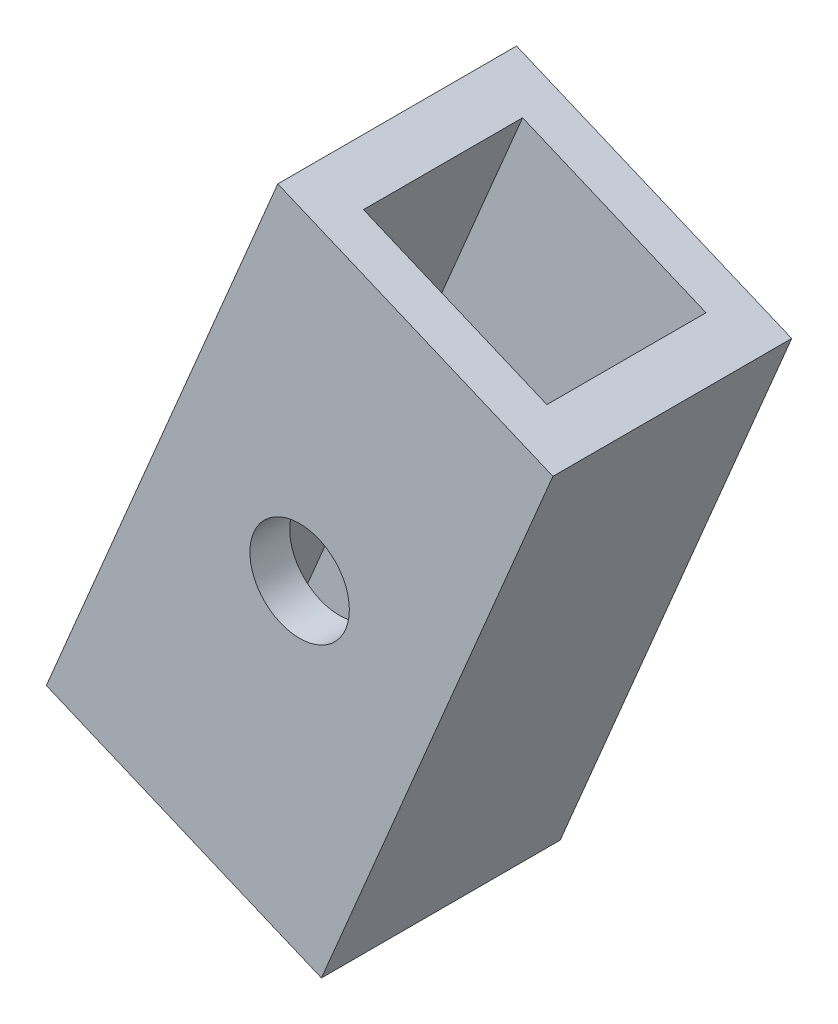
ISO-10303-21;
HEADER;
FILE_DESCRIPTION(('STEP AP214'),'2;1');
FILE_NAME('part.step','',(''),(''),'','','');
FILE_SCHEMA(('AUTOMOTIVE_DESIGN { 1 0 10303 214 1 1 1 1 }'));
ENDSEC;
DATA;
#1=APPLICATION_CONTEXT('core data for automotive mechanical design processes');
#2=APPLICATION_PROTOCOL_DEFINITION('international standard','automotive_design',2000,#1);
#3=PRODUCT_CONTEXT('',#1,'mechanical');
#4=PRODUCT('Part','Part','',(#3));
#5=PRODUCT_RELATED_PRODUCT_CATEGORY('part','',(#4));
#6=PRODUCT_DEFINITION_FORMATION('','',#4);
#7=PRODUCT_DEFINITION_CONTEXT('part definition',#1,'design');
#8=PRODUCT_DEFINITION('design','',#6,#7);
#9=PRODUCT_DEFINITION_SHAPE('','',#8);
#10=(LENGTH_UNIT() NAMED_UNIT(*) SI_UNIT(.MILLI.,.METRE.));
#11=(NAMED_UNIT(*) PLANE_ANGLE_UNIT() SI_UNIT($,.RADIAN.));
#12=(NAMED_UNIT(*) SI_UNIT($,.STERADIAN.) SOLID_ANGLE_UNIT());
#13=UNCERTAINTY_MEASURE_WITH_UNIT(LENGTH_MEASURE(1.E-05),#10,'distance_accuracy_value','');
#14=(GEOMETRIC_REPRESENTATION_CONTEXT(3) GLOBAL_UNCERTAINTY_ASSIGNED_CONTEXT((#13)) GLOBAL_UNIT_ASSIGNED_CONTEXT((#10,
#11,#12)) REPRESENTATION_CONTEXT('',''));
#15=CARTESIAN_POINT('',(0.,0.,0.));
#16=DIRECTION('',(0.,0.,1.));
#17=DIRECTION('',(1.,0.,0.));
#18=AXIS2_PLACEMENT_3D('',#15,#16,#17);
#19=CARTESIAN_POINT('',(59.7500148014689,161.344102205265,20.));
#20=DIRECTION('',(0.921732380952381,-0.387826530685892,0.));
#21=DIRECTION('',(0.387826530685892,0.921732380952381,0.));
#22=AXIS2_PLACEMENT_3D('',#19,#20,#21);
#23=PLANE('',#22);
#24=DIRECTION('',(-0.387826530685892,-0.921732380952381,0.));
#25=VECTOR('',#24,1.);
#26=CARTESIAN_POINT('',(59.7500148014689,161.344102205265,8.));
#27=LINE('',#26,#25);
#28=CARTESIAN_POINT('',(59.7500148014689,161.344102205265,8.));
#29=VERTEX_POINT('',#28);
#30=CARTESIAN_POINT('',(48.1152188808921,133.692130776694,8.));
#31=VERTEX_POINT('',#30);
#32=EDGE_CURVE('E135',#29,#31,#27,.T.);
#33=ORIENTED_EDGE('',*,*,#32,.T.);
#34=DIRECTION('',(0.,0.,-1.));
#35=VECTOR('',#34,1.);
#36=CARTESIAN_POINT('',(48.1152188808921,133.692130776694,20.));
#37=LINE('',#36,#35);
#38=CARTESIAN_POINT('',(48.1152188808921,133.692130776694,20.));
#39=VERTEX_POINT('',#38);
#40=EDGE_CURVE('E11',#39,#31,#37,.T.);
#41=ORIENTED_EDGE('',*,*,#40,.F.);
#42=DIRECTION('',(-0.387826530685892,-0.921732380952381,0.));
#43=VECTOR('',#42,1.);
#44=CARTESIAN_POINT('',(59.7500148014689,161.344102205265,20.));
#45=LINE('',#44,#43);
#46=CARTESIAN_POINT('',(59.7500148014689,161.344102205265,20.));
#47=VERTEX_POINT('',#46);
#48=EDGE_CURVE('E136',#47,#39,#45,.T.);
#49=ORIENTED_EDGE('',*,*,#48,.F.);
#50=DIRECTION('',(0.,0.,-1.));
#51=VECTOR('',#50,1.);
#52=CARTESIAN_POINT('',(59.7500148014689,161.344102205265,20.));
#53=LINE('',#52,#51);
#54=EDGE_CURVE('E146',#47,#29,#53,.T.);
#55=ORIENTED_EDGE('',*,*,#54,.T.);
#56=EDGE_LOOP('',(#33,#41,#49,#55));
#57=FACE_BOUND('',#56,.T.);
#58=ADVANCED_FACE('F34',(#57),#23,.F.);
#59=CARTESIAN_POINT('',(48.1152188808921,133.692130776694,20.));
#60=DIRECTION('',(0.387826530685892,0.921732380952381,0.));
#61=DIRECTION('',(-0.921732380952381,0.387826530685892,0.));
#62=AXIS2_PLACEMENT_3D('',#59,#60,#61);
#63=PLANE('',#62);
#64=DIRECTION('',(0.,0.,-1.));
#65=VECTOR('',#64,1.);
#66=CARTESIAN_POINT('',(50.4195498332731,132.722564449979,20.));
#67=LINE('',#66,#65);
#68=CARTESIAN_POINT('',(50.4195498332731,132.722564449979,18.));
#69=VERTEX_POINT('',#68);
#70=CARTESIAN_POINT('',(50.4195498332731,132.722564449979,10.0020474927602));
#71=VERTEX_POINT('',#70);
#72=EDGE_CURVE('E130',#69,#71,#67,.T.);
#73=ORIENTED_EDGE('',*,*,#72,.F.);
#74=DIRECTION('',(0.921732380952381,-0.387826530685892,0.));
#75=VECTOR('',#74,1.);
#76=CARTESIAN_POINT('',(48.1152188808921,133.692130776694,18.));
#77=LINE('',#76,#75);
#78=CARTESIAN_POINT('',(59.6368736427969,128.84429914312,18.));
#79=VERTEX_POINT('',#78);
#80=EDGE_CURVE('E132',#69,#79,#77,.T.);
#81=ORIENTED_EDGE('',*,*,#80,.T.);
#82=DIRECTION('',(0.,0.,-1.));
#83=VECTOR('',#82,1.);
#84=CARTESIAN_POINT('',(59.6368736427969,128.84429914312,20.));
#85=LINE('',#84,#83);
#86=CARTESIAN_POINT('',(59.6368736427969,128.84429914312,10.0020474927602));
#87=VERTEX_POINT('',#86);
#88=EDGE_CURVE('E125',#79,#87,#85,.T.);
#89=ORIENTED_EDGE('',*,*,#88,.T.);
#90=DIRECTION('',(0.921732380952381,-0.387826530685892,0.));
#91=VECTOR('',#90,1.);
#92=CARTESIAN_POINT('',(48.1152188808921,133.692130776694,10.0020474927602));
#93=LINE('',#92,#91);
#94=EDGE_CURVE('E105',#71,#87,#93,.T.);
#95=ORIENTED_EDGE('',*,*,#94,.F.);
#96=EDGE_LOOP('',(#73,#81,#89,#95));
#97=FACE_BOUND('',#96,.T.);
#98=DIRECTION('',(0.921732380952381,-0.387826530685892,0.));
#99=VECTOR('',#98,1.);
#100=CARTESIAN_POINT('',(48.1152188808921,133.692130776694,8.));
#101=LINE('',#100,#99);
#102=CARTESIAN_POINT('',(61.9412045951779,127.874732816405,8.));
#103=VERTEX_POINT('',#102);
#104=EDGE_CURVE('E149',#31,#103,#101,.T.);
#105=ORIENTED_EDGE('',*,*,#104,.T.);
#106=DIRECTION('',(0.,0.,-1.));
#107=VECTOR('',#106,1.);
#108=CARTESIAN_POINT('',(61.9412045951779,127.874732816405,20.));
#109=LINE('',#108,#107);
#110=CARTESIAN_POINT('',(61.9412045951779,127.874732816405,20.));
#111=VERTEX_POINT('',#110);
#112=EDGE_CURVE('E42',#111,#103,#109,.T.);
#113=ORIENTED_EDGE('',*,*,#112,.F.);
#114=DIRECTION('',(0.921732380952381,-0.387826530685892,0.));
#115=VECTOR('',#114,1.);
#116=CARTESIAN_POINT('',(48.1152188808921,133.692130776694,20.));
#117=LINE('',#116,#115);
#118=EDGE_CURVE('E139',#39,#111,#117,.T.);
#119=ORIENTED_EDGE('',*,*,#118,.F.);
#120=ORIENTED_EDGE('',*,*,#40,.T.);
#121=EDGE_LOOP('',(#105,#113,#119,#120));
#122=FACE_BOUND('',#121,.T.);
#123=ADVANCED_FACE('F178',(#97,#122),#63,.F.);
#124=CARTESIAN_POINT('',(73.5760005157546,155.526704244977,20.));
#125=DIRECTION('',(-0.921732380952381,0.387826530685892,0.));
#126=DIRECTION('',(-0.387826530685892,-0.921732380952381,0.));
#127=AXIS2_PLACEMENT_3D('',#124,#125,#126);
#128=PLANE('',#127);
#129=DIRECTION('',(0.387826530685891,0.921732380952381,0.));
#130=VECTOR('',#129,1.);
#131=CARTESIAN_POINT('',(73.5760005157546,155.526704244977,8.));
#132=LINE('',#131,#130);
#133=CARTESIAN_POINT('',(73.5760005157546,155.526704244977,8.));
#134=VERTEX_POINT('',#133);
#135=EDGE_CURVE('E151',#103,#134,#132,.T.);
#136=ORIENTED_EDGE('',*,*,#135,.T.);
#137=DIRECTION('',(0.,0.,-1.));
#138=VECTOR('',#137,1.);
#139=CARTESIAN_POINT('',(73.5760005157546,155.526704244977,20.));
#140=LINE('',#139,#138);
#141=CARTESIAN_POINT('',(73.5760005157546,155.526704244977,20.));
#142=VERTEX_POINT('',#141);
#143=EDGE_CURVE('E156',#142,#134,#140,.T.);
#144=ORIENTED_EDGE('',*,*,#143,.F.);
#145=DIRECTION('',(0.387826530685891,0.921732380952381,0.));
#146=VECTOR('',#145,1.);
#147=CARTESIAN_POINT('',(73.5760005157546,155.526704244977,20.));
#148=LINE('',#147,#146);
#149=EDGE_CURVE('E142',#111,#142,#148,.T.);
#150=ORIENTED_EDGE('',*,*,#149,.F.);
#151=ORIENTED_EDGE('',*,*,#112,.T.);
#152=EDGE_LOOP('',(#136,#144,#150,#151));
#153=FACE_BOUND('',#152,.T.);
#154=ADVANCED_FACE('F164',(#153),#128,.F.);
#155=CARTESIAN_POINT('',(59.7500148014689,161.344102205265,20.));
#156=DIRECTION('',(-0.387826530685892,-0.921732380952381,0.));
#157=DIRECTION('',(0.921732380952381,-0.387826530685892,0.));
#158=AXIS2_PLACEMENT_3D('',#155,#156,#157);
#159=PLANE('',#158);
#160=DIRECTION('',(0.,0.,-1.));
#161=VECTOR('',#160,1.);
#162=CARTESIAN_POINT('',(71.2716695633737,156.496270571691,1.00613961606655E-13));
#163=LINE('',#162,#161);
#164=CARTESIAN_POINT('',(71.2716695633736,156.496270571691,18.));
#165=VERTEX_POINT('',#164);
#166=CARTESIAN_POINT('',(71.2716695633737,156.496270571691,10.0020474927602));
#167=VERTEX_POINT('',#166);
#168=EDGE_CURVE('E111',#165,#167,#163,.T.);
#169=ORIENTED_EDGE('',*,*,#168,.F.);
#170=DIRECTION('',(0.921732380952381,-0.387826530685893,0.));
#171=VECTOR('',#170,1.);
#172=CARTESIAN_POINT('',(66.6630076586119,158.435403225121,18.));
#173=LINE('',#172,#171);
#174=CARTESIAN_POINT('',(62.0543457538499,160.37453587855,18.));
#175=VERTEX_POINT('',#174);
#176=EDGE_CURVE('E57',#175,#165,#173,.T.);
#177=ORIENTED_EDGE('',*,*,#176,.F.);
#178=DIRECTION('',(0.,0.,-1.));
#179=VECTOR('',#178,1.);
#180=CARTESIAN_POINT('',(62.0543457538499,160.37453587855,1.00613961606655E-13));
#181=LINE('',#180,#179);
#182=CARTESIAN_POINT('',(62.0543457538499,160.37453587855,10.0020474927602));
#183=VERTEX_POINT('',#182);
#184=EDGE_CURVE('E118',#175,#183,#181,.T.);
#185=ORIENTED_EDGE('',*,*,#184,.T.);
#186=DIRECTION('',(0.921732380952381,-0.387826530685893,0.));
#187=VECTOR('',#186,1.);
#188=CARTESIAN_POINT('',(66.6630076586119,158.435403225121,10.0020474927602));
#189=LINE('',#188,#187);
#190=EDGE_CURVE('E102',#183,#167,#189,.T.);
#191=ORIENTED_EDGE('',*,*,#190,.T.);
#192=EDGE_LOOP('',(#169,#177,#185,#191));
#193=FACE_BOUND('',#192,.T.);
#194=DIRECTION('',(-0.921732380952381,0.387826530685892,0.));
#195=VECTOR('',#194,1.);
#196=CARTESIAN_POINT('',(59.7500148014689,161.344102205265,8.));
#197=LINE('',#196,#195);
#198=EDGE_CURVE('E140',#134,#29,#197,.T.);
#199=ORIENTED_EDGE('',*,*,#198,.T.);
#200=ORIENTED_EDGE('',*,*,#54,.F.);
#201=DIRECTION('',(-0.921732380952381,0.387826530685892,0.));
#202=VECTOR('',#201,1.);
#203=CARTESIAN_POINT('',(59.7500148014689,161.344102205265,20.));
#204=LINE('',#203,#202);
#205=EDGE_CURVE('E144',#142,#47,#204,.T.);
#206=ORIENTED_EDGE('',*,*,#205,.F.);
#207=ORIENTED_EDGE('',*,*,#143,.T.);
#208=EDGE_LOOP('',(#199,#200,#206,#207));
#209=FACE_BOUND('',#208,.T.);
#210=ADVANCED_FACE('F115',(#193,#209),#159,.F.);
#211=CARTESIAN_POINT('',(0.,0.,20.));
#212=DIRECTION('',(0.,0.,1.));
#213=DIRECTION('',(1.,0.,0.));
#214=AXIS2_PLACEMENT_3D('',#211,#212,#213);
#215=PLANE('',#214);
#216=CARTESIAN_POINT('',(60.8456096983234,144.609417510835,20.));
#217=DIRECTION('',(0.,0.,1.));
#218=DIRECTION('',(1.,0.,0.));
#219=AXIS2_PLACEMENT_3D('',#216,#217,#218);
#220=CIRCLE('',#219,2.5);
#221=CARTESIAN_POINT('',(63.3456096983234,144.609417510835,20.));
#222=VERTEX_POINT('',#221);
#223=EDGE_CURVE('E228',#222,#222,#220,.T.);
#224=ORIENTED_EDGE('',*,*,#223,.F.);
#225=EDGE_LOOP('',(#224));
#226=FACE_BOUND('',#225,.T.);
#227=ORIENTED_EDGE('',*,*,#48,.T.);
#228=ORIENTED_EDGE('',*,*,#118,.T.);
#229=ORIENTED_EDGE('',*,*,#149,.T.);
#230=ORIENTED_EDGE('',*,*,#205,.T.);
#231=EDGE_LOOP('',(#227,#228,#229,#230));
#232=FACE_BOUND('',#231,.T.);
#233=ADVANCED_FACE('F177',(#226,#232),#215,.T.);
#234=CARTESIAN_POINT('',(0.,0.,8.));
#235=DIRECTION('',(0.,0.,1.));
#236=DIRECTION('',(1.,0.,0.));
#237=AXIS2_PLACEMENT_3D('',#234,#235,#236);
#238=PLANE('',#237);
#239=CARTESIAN_POINT('',(60.8456096983234,144.609417510835,8.));
#240=DIRECTION('',(0.,0.,1.));
#241=DIRECTION('',(1.,0.,0.));
#242=AXIS2_PLACEMENT_3D('',#239,#240,#241);
#243=CIRCLE('',#242,2.5);
#244=CARTESIAN_POINT('',(63.3456096983234,144.609417510835,8.));
#245=VERTEX_POINT('',#244);
#246=EDGE_CURVE('E222',#245,#245,#243,.T.);
#247=ORIENTED_EDGE('',*,*,#246,.T.);
#248=EDGE_LOOP('',(#247));
#249=FACE_BOUND('',#248,.T.);
#250=ORIENTED_EDGE('',*,*,#32,.F.);
#251=ORIENTED_EDGE('',*,*,#198,.F.);
#252=ORIENTED_EDGE('',*,*,#135,.F.);
#253=ORIENTED_EDGE('',*,*,#104,.F.);
#254=EDGE_LOOP('',(#250,#251,#252,#253));
#255=FACE_BOUND('',#254,.T.);
#256=ADVANCED_FACE('F170',(#249,#255),#238,.F.);
#257=CARTESIAN_POINT('',(53.0890790846057,126.174769891788,18.));
#258=DIRECTION('',(0.,0.,1.));
#259=DIRECTION('',(1.,0.,0.));
#260=AXIS2_PLACEMENT_3D('',#257,#258,#259);
#261=PLANE('',#260);
#262=CARTESIAN_POINT('',(60.8456096983234,144.609417510835,18.));
#263=DIRECTION('',(0.,0.,1.));
#264=DIRECTION('',(1.,0.,0.));
#265=AXIS2_PLACEMENT_3D('',#262,#263,#264);
#266=CIRCLE('',#265,2.5);
#267=CARTESIAN_POINT('',(63.3456096983234,144.609417510835,18.));
#268=VERTEX_POINT('',#267);
#269=EDGE_CURVE('E223',#268,#268,#266,.T.);
#270=ORIENTED_EDGE('',*,*,#269,.T.);
#271=EDGE_LOOP('',(#270));
#272=FACE_BOUND('',#271,.T.);
#273=DIRECTION('',(0.387826530685892,0.921732380952381,0.));
#274=VECTOR('',#273,1.);
#275=CARTESIAN_POINT('',(48.4804171798436,128.113902545217,18.));
#276=LINE('',#275,#274);
#277=EDGE_CURVE('E123',#69,#175,#276,.T.);
#278=ORIENTED_EDGE('',*,*,#277,.T.);
#279=ORIENTED_EDGE('',*,*,#176,.T.);
#280=DIRECTION('',(0.387826530685892,0.921732380952381,0.));
#281=VECTOR('',#280,1.);
#282=CARTESIAN_POINT('',(57.6977409893674,124.235637238358,18.));
#283=LINE('',#282,#281);
#284=EDGE_CURVE('E108',#79,#165,#283,.T.);
#285=ORIENTED_EDGE('',*,*,#284,.F.);
#286=ORIENTED_EDGE('',*,*,#80,.F.);
#287=EDGE_LOOP('',(#278,#279,#285,#286));
#288=FACE_BOUND('',#287,.T.);
#289=ADVANCED_FACE('F192',(#272,#288),#261,.F.);
#290=CARTESIAN_POINT('',(48.4804171798436,128.113902545217,1.00613961606655E-13));
#291=DIRECTION('',(0.921732380952381,-0.387826530685892,0.));
#292=DIRECTION('',(0.387826530685892,0.921732380952381,0.));
#293=AXIS2_PLACEMENT_3D('',#290,#291,#292);
#294=PLANE('',#293);
#295=ORIENTED_EDGE('',*,*,#72,.T.);
#296=DIRECTION('',(0.387826530685892,0.921732380952381,0.));
#297=VECTOR('',#296,1.);
#298=CARTESIAN_POINT('',(48.4804171798436,128.113902545217,10.0020474927602));
#299=LINE('',#298,#297);
#300=EDGE_CURVE('E107',#71,#183,#299,.T.);
#301=ORIENTED_EDGE('',*,*,#300,.T.);
#302=ORIENTED_EDGE('',*,*,#184,.F.);
#303=ORIENTED_EDGE('',*,*,#277,.F.);
#304=EDGE_LOOP('',(#295,#301,#302,#303));
#305=FACE_BOUND('',#304,.T.);
#306=ADVANCED_FACE('F199',(#305),#294,.T.);
#307=CARTESIAN_POINT('',(53.0890790846057,126.174769891788,10.0020474927602));
#308=DIRECTION('',(0.,0.,1.));
#309=DIRECTION('',(1.,0.,0.));
#310=AXIS2_PLACEMENT_3D('',#307,#308,#309);
#311=PLANE('',#310);
#312=CARTESIAN_POINT('',(60.8456096983234,144.609417510835,10.0020474927602));
#313=DIRECTION('',(0.,0.,1.));
#314=DIRECTION('',(1.,0.,0.));
#315=AXIS2_PLACEMENT_3D('',#312,#313,#314);
#316=CIRCLE('',#315,2.5);
#317=CARTESIAN_POINT('',(63.3456096983234,144.609417510835,10.0020474927602));
#318=VERTEX_POINT('',#317);
#319=EDGE_CURVE('E37',#318,#318,#316,.T.);
#320=ORIENTED_EDGE('',*,*,#319,.F.);
#321=EDGE_LOOP('',(#320));
#322=FACE_BOUND('',#321,.T.);
#323=ORIENTED_EDGE('',*,*,#94,.T.);
#324=DIRECTION('',(0.387826530685892,0.921732380952381,0.));
#325=VECTOR('',#324,1.);
#326=CARTESIAN_POINT('',(57.6977409893674,124.235637238358,10.0020474927602));
#327=LINE('',#326,#325);
#328=EDGE_CURVE('E49',#87,#167,#327,.T.);
#329=ORIENTED_EDGE('',*,*,#328,.T.);
#330=ORIENTED_EDGE('',*,*,#190,.F.);
#331=ORIENTED_EDGE('',*,*,#300,.F.);
#332=EDGE_LOOP('',(#323,#329,#330,#331));
#333=FACE_BOUND('',#332,.T.);
#334=ADVANCED_FACE('F99',(#322,#333),#311,.T.);
#335=CARTESIAN_POINT('',(57.6977409893674,124.235637238358,1.00613961606655E-13));
#336=DIRECTION('',(0.921732380952381,-0.387826530685892,0.));
#337=DIRECTION('',(0.387826530685892,0.921732380952381,0.));
#338=AXIS2_PLACEMENT_3D('',#335,#336,#337);
#339=PLANE('',#338);
#340=ORIENTED_EDGE('',*,*,#284,.T.);
#341=ORIENTED_EDGE('',*,*,#168,.T.);
#342=ORIENTED_EDGE('',*,*,#328,.F.);
#343=ORIENTED_EDGE('',*,*,#88,.F.);
#344=EDGE_LOOP('',(#340,#341,#342,#343));
#345=FACE_BOUND('',#344,.T.);
#346=ADVANCED_FACE('F112',(#345),#339,.F.);
#347=CARTESIAN_POINT('',(60.8456096983234,144.609417510835,-9.99795250723982));
#348=DIRECTION('',(0.,0.,1.));
#349=DIRECTION('',(1.,0.,0.));
#350=AXIS2_PLACEMENT_3D('',#347,#348,#349);
#351=CYLINDRICAL_SURFACE('',#350,2.5);
#352=ORIENTED_EDGE('',*,*,#319,.T.);
#353=EDGE_LOOP('',(#352));
#354=FACE_BOUND('',#353,.T.);
#355=ORIENTED_EDGE('',*,*,#246,.F.);
#356=EDGE_LOOP('',(#355));
#357=FACE_BOUND('',#356,.T.);
#358=ADVANCED_FACE('F203',(#354,#357),#351,.F.);
#359=ORIENTED_EDGE('',*,*,#223,.T.);
#360=EDGE_LOOP('',(#359));
#361=FACE_BOUND('',#360,.T.);
#362=ORIENTED_EDGE('',*,*,#269,.F.);
#363=EDGE_LOOP('',(#362));
#364=FACE_BOUND('',#363,.T.);
#365=ADVANCED_FACE('F211',(#361,#364),#351,.F.);
#366=CLOSED_SHELL('',(#58,#123,#154,#210,#233,#256,#289,#306,#334,#346,#358,#365));
#367=MANIFOLD_SOLID_BREP('B2',#366);
#368=ADVANCED_BREP_SHAPE_REPRESENTATION('',(#18,#367),#14);
#369=SHAPE_DEFINITION_REPRESENTATION(#9,#368);
ENDSEC;
END-ISO-10303-21;
